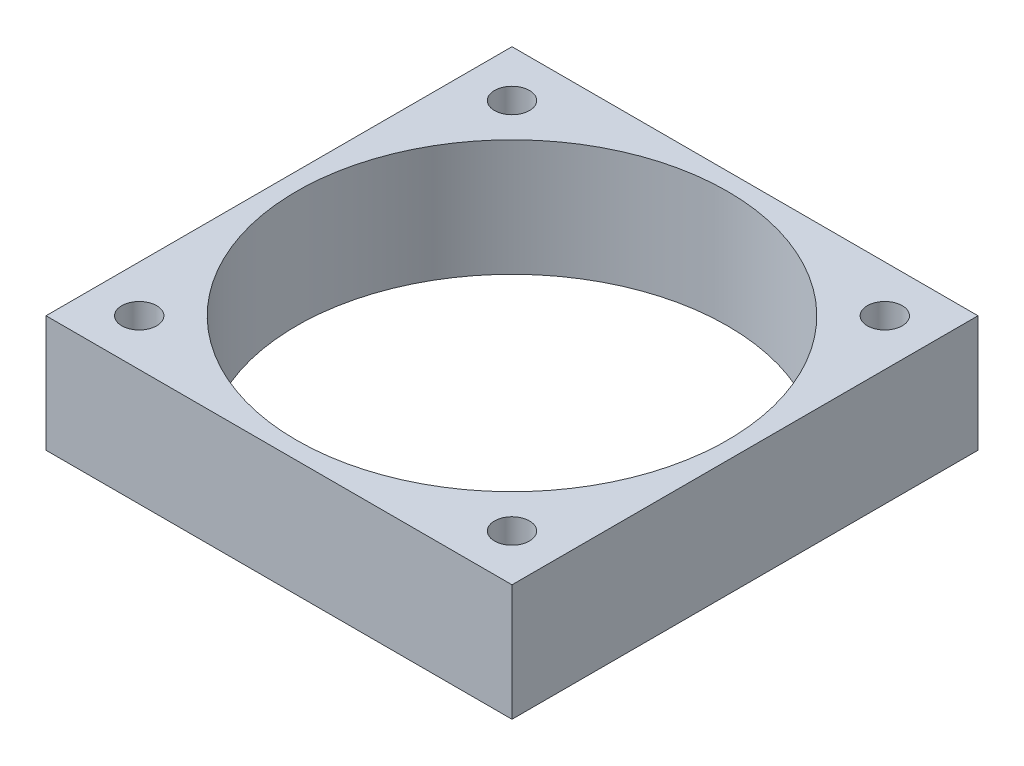
ISO-10303-21;
HEADER;
FILE_DESCRIPTION(('STEP AP214'),'2;1');
FILE_NAME('part.step','',(''),(''),'','','');
FILE_SCHEMA(('AUTOMOTIVE_DESIGN { 1 0 10303 214 1 1 1 1 }'));
ENDSEC;
DATA;
#1=APPLICATION_CONTEXT('core data for automotive mechanical design processes');
#2=APPLICATION_PROTOCOL_DEFINITION('international standard','automotive_design',2000,#1);
#3=PRODUCT_CONTEXT('',#1,'mechanical');
#4=PRODUCT('Part','Part','',(#3));
#5=PRODUCT_RELATED_PRODUCT_CATEGORY('part','',(#4));
#6=PRODUCT_DEFINITION_FORMATION('','',#4);
#7=PRODUCT_DEFINITION_CONTEXT('part definition',#1,'design');
#8=PRODUCT_DEFINITION('design','',#6,#7);
#9=PRODUCT_DEFINITION_SHAPE('','',#8);
#10=(LENGTH_UNIT() NAMED_UNIT(*) SI_UNIT(.MILLI.,.METRE.));
#11=(NAMED_UNIT(*) PLANE_ANGLE_UNIT() SI_UNIT($,.RADIAN.));
#12=(NAMED_UNIT(*) SI_UNIT($,.STERADIAN.) SOLID_ANGLE_UNIT());
#13=UNCERTAINTY_MEASURE_WITH_UNIT(LENGTH_MEASURE(1.E-05),#10,'distance_accuracy_value','');
#14=(GEOMETRIC_REPRESENTATION_CONTEXT(3) GLOBAL_UNCERTAINTY_ASSIGNED_CONTEXT((#13)) GLOBAL_UNIT_ASSIGNED_CONTEXT((#10,
#11,#12)) REPRESENTATION_CONTEXT('',''));
#15=CARTESIAN_POINT('',(0.,0.,0.));
#16=DIRECTION('',(0.,0.,1.));
#17=DIRECTION('',(1.,0.,0.));
#18=AXIS2_PLACEMENT_3D('',#15,#16,#17);
#19=CARTESIAN_POINT('',(0.,10.,0.));
#20=DIRECTION('',(1.,0.,0.));
#21=DIRECTION('',(0.,0.,-1.));
#22=AXIS2_PLACEMENT_3D('',#19,#20,#21);
#23=PLANE('',#22);
#24=DIRECTION('',(0.,0.,1.));
#25=VECTOR('',#24,1.);
#26=CARTESIAN_POINT('',(0.,0.,0.));
#27=LINE('',#26,#25);
#28=CARTESIAN_POINT('',(0.,0.,0.));
#29=VERTEX_POINT('',#28);
#30=CARTESIAN_POINT('',(0.,0.,40.));
#31=VERTEX_POINT('',#30);
#32=EDGE_CURVE('E95',#29,#31,#27,.T.);
#33=ORIENTED_EDGE('',*,*,#32,.T.);
#34=DIRECTION('',(0.,-1.,0.));
#35=VECTOR('',#34,1.);
#36=CARTESIAN_POINT('',(0.,10.,40.));
#37=LINE('',#36,#35);
#38=CARTESIAN_POINT('',(0.,10.,40.));
#39=VERTEX_POINT('',#38);
#40=EDGE_CURVE('E11',#39,#31,#37,.T.);
#41=ORIENTED_EDGE('',*,*,#40,.F.);
#42=DIRECTION('',(0.,0.,1.));
#43=VECTOR('',#42,1.);
#44=CARTESIAN_POINT('',(0.,10.,0.));
#45=LINE('',#44,#43);
#46=CARTESIAN_POINT('',(0.,10.,0.));
#47=VERTEX_POINT('',#46);
#48=EDGE_CURVE('E83',#47,#39,#45,.T.);
#49=ORIENTED_EDGE('',*,*,#48,.F.);
#50=DIRECTION('',(0.,-1.,0.));
#51=VECTOR('',#50,1.);
#52=CARTESIAN_POINT('',(0.,10.,0.));
#53=LINE('',#52,#51);
#54=EDGE_CURVE('E91',#47,#29,#53,.T.);
#55=ORIENTED_EDGE('',*,*,#54,.T.);
#56=EDGE_LOOP('',(#33,#41,#49,#55));
#57=FACE_BOUND('',#56,.T.);
#58=ADVANCED_FACE('F32',(#57),#23,.F.);
#59=CARTESIAN_POINT('',(0.,10.,40.));
#60=DIRECTION('',(0.,0.,-1.));
#61=DIRECTION('',(-1.,0.,0.));
#62=AXIS2_PLACEMENT_3D('',#59,#60,#61);
#63=PLANE('',#62);
#64=DIRECTION('',(1.,0.,0.));
#65=VECTOR('',#64,1.);
#66=CARTESIAN_POINT('',(0.,0.,40.));
#67=LINE('',#66,#65);
#68=CARTESIAN_POINT('',(40.,0.,40.));
#69=VERTEX_POINT('',#68);
#70=EDGE_CURVE('E87',#31,#69,#67,.T.);
#71=ORIENTED_EDGE('',*,*,#70,.T.);
#72=DIRECTION('',(0.,-1.,0.));
#73=VECTOR('',#72,1.);
#74=CARTESIAN_POINT('',(40.,10.,40.));
#75=LINE('',#74,#73);
#76=CARTESIAN_POINT('',(40.,10.,40.));
#77=VERTEX_POINT('',#76);
#78=EDGE_CURVE('E40',#77,#69,#75,.T.);
#79=ORIENTED_EDGE('',*,*,#78,.F.);
#80=DIRECTION('',(1.,0.,0.));
#81=VECTOR('',#80,1.);
#82=CARTESIAN_POINT('',(0.,10.,40.));
#83=LINE('',#82,#81);
#84=EDGE_CURVE('E78',#39,#77,#83,.T.);
#85=ORIENTED_EDGE('',*,*,#84,.F.);
#86=ORIENTED_EDGE('',*,*,#40,.T.);
#87=EDGE_LOOP('',(#71,#79,#85,#86));
#88=FACE_BOUND('',#87,.T.);
#89=ADVANCED_FACE('F86',(#88),#63,.F.);
#90=CARTESIAN_POINT('',(40.,10.,0.));
#91=DIRECTION('',(-1.,0.,0.));
#92=DIRECTION('',(0.,0.,1.));
#93=AXIS2_PLACEMENT_3D('',#90,#91,#92);
#94=PLANE('',#93);
#95=DIRECTION('',(0.,0.,-1.));
#96=VECTOR('',#95,1.);
#97=CARTESIAN_POINT('',(40.,0.,0.));
#98=LINE('',#97,#96);
#99=CARTESIAN_POINT('',(40.,0.,0.));
#100=VERTEX_POINT('',#99);
#101=EDGE_CURVE('E65',#69,#100,#98,.T.);
#102=ORIENTED_EDGE('',*,*,#101,.T.);
#103=DIRECTION('',(0.,-1.,0.));
#104=VECTOR('',#103,1.);
#105=CARTESIAN_POINT('',(40.,10.,0.));
#106=LINE('',#105,#104);
#107=CARTESIAN_POINT('',(40.,10.,0.));
#108=VERTEX_POINT('',#107);
#109=EDGE_CURVE('E88',#108,#100,#106,.T.);
#110=ORIENTED_EDGE('',*,*,#109,.F.);
#111=DIRECTION('',(0.,0.,-1.));
#112=VECTOR('',#111,1.);
#113=CARTESIAN_POINT('',(40.,10.,0.));
#114=LINE('',#113,#112);
#115=EDGE_CURVE('E81',#77,#108,#114,.T.);
#116=ORIENTED_EDGE('',*,*,#115,.F.);
#117=ORIENTED_EDGE('',*,*,#78,.T.);
#118=EDGE_LOOP('',(#102,#110,#116,#117));
#119=FACE_BOUND('',#118,.T.);
#120=ADVANCED_FACE('F89',(#119),#94,.F.);
#121=CARTESIAN_POINT('',(0.,10.,0.));
#122=DIRECTION('',(0.,0.,1.));
#123=DIRECTION('',(1.,0.,0.));
#124=AXIS2_PLACEMENT_3D('',#121,#122,#123);
#125=PLANE('',#124);
#126=DIRECTION('',(-1.,0.,0.));
#127=VECTOR('',#126,1.);
#128=CARTESIAN_POINT('',(0.,0.,0.));
#129=LINE('',#128,#127);
#130=EDGE_CURVE('E71',#100,#29,#129,.T.);
#131=ORIENTED_EDGE('',*,*,#130,.T.);
#132=ORIENTED_EDGE('',*,*,#54,.F.);
#133=DIRECTION('',(-1.,0.,0.));
#134=VECTOR('',#133,1.);
#135=CARTESIAN_POINT('',(0.,10.,0.));
#136=LINE('',#135,#134);
#137=EDGE_CURVE('E48',#108,#47,#136,.T.);
#138=ORIENTED_EDGE('',*,*,#137,.F.);
#139=ORIENTED_EDGE('',*,*,#109,.T.);
#140=EDGE_LOOP('',(#131,#132,#138,#139));
#141=FACE_BOUND('',#140,.T.);
#142=ADVANCED_FACE('F103',(#141),#125,.F.);
#143=CARTESIAN_POINT('',(0.,10.,0.));
#144=DIRECTION('',(0.,1.,0.));
#145=DIRECTION('',(0.,0.,1.));
#146=AXIS2_PLACEMENT_3D('',#143,#144,#145);
#147=PLANE('',#146);
#148=CARTESIAN_POINT('',(20.,10.,20.));
#149=DIRECTION('',(0.,1.,0.));
#150=DIRECTION('',(0.,0.,1.));
#151=AXIS2_PLACEMENT_3D('',#148,#149,#150);
#152=CIRCLE('',#151,18.5);
#153=CARTESIAN_POINT('',(20.,10.,38.5));
#154=VERTEX_POINT('',#153);
#155=EDGE_CURVE('E133',#154,#154,#152,.T.);
#156=ORIENTED_EDGE('',*,*,#155,.F.);
#157=EDGE_LOOP('',(#156));
#158=FACE_BOUND('',#157,.T.);
#159=CARTESIAN_POINT('',(36.,10.,35.9999999999996));
#160=DIRECTION('',(0.,1.,0.));
#161=DIRECTION('',(0.,0.,1.));
#162=AXIS2_PLACEMENT_3D('',#159,#160,#161);
#163=CIRCLE('',#162,1.5);
#164=CARTESIAN_POINT('',(36.,10.,37.4999999999996));
#165=VERTEX_POINT('',#164);
#166=EDGE_CURVE('E128',#165,#165,#163,.T.);
#167=ORIENTED_EDGE('',*,*,#166,.F.);
#168=EDGE_LOOP('',(#167));
#169=FACE_BOUND('',#168,.T.);
#170=CARTESIAN_POINT('',(35.9999999999999,10.,3.99999999999956));
#171=DIRECTION('',(0.,1.,0.));
#172=DIRECTION('',(0.,0.,1.));
#173=AXIS2_PLACEMENT_3D('',#170,#171,#172);
#174=CIRCLE('',#173,1.5);
#175=CARTESIAN_POINT('',(35.9999999999999,10.,5.49999999999956));
#176=VERTEX_POINT('',#175);
#177=EDGE_CURVE('E122',#176,#176,#174,.T.);
#178=ORIENTED_EDGE('',*,*,#177,.F.);
#179=EDGE_LOOP('',(#178));
#180=FACE_BOUND('',#179,.T.);
#181=CARTESIAN_POINT('',(3.99999999999989,10.,4.));
#182=DIRECTION('',(0.,1.,0.));
#183=DIRECTION('',(0.,0.,1.));
#184=AXIS2_PLACEMENT_3D('',#181,#182,#183);
#185=CIRCLE('',#184,1.5);
#186=CARTESIAN_POINT('',(3.99999999999989,10.,5.5));
#187=VERTEX_POINT('',#186);
#188=EDGE_CURVE('E115',#187,#187,#185,.T.);
#189=ORIENTED_EDGE('',*,*,#188,.F.);
#190=EDGE_LOOP('',(#189));
#191=FACE_BOUND('',#190,.T.);
#192=CARTESIAN_POINT('',(4.,10.,36.));
#193=DIRECTION('',(0.,1.,0.));
#194=DIRECTION('',(0.,0.,1.));
#195=AXIS2_PLACEMENT_3D('',#192,#193,#194);
#196=CIRCLE('',#195,1.5);
#197=CARTESIAN_POINT('',(4.,10.,37.5));
#198=VERTEX_POINT('',#197);
#199=EDGE_CURVE('E109',#198,#198,#196,.T.);
#200=ORIENTED_EDGE('',*,*,#199,.F.);
#201=EDGE_LOOP('',(#200));
#202=FACE_BOUND('',#201,.T.);
#203=ORIENTED_EDGE('',*,*,#48,.T.);
#204=ORIENTED_EDGE('',*,*,#84,.T.);
#205=ORIENTED_EDGE('',*,*,#115,.T.);
#206=ORIENTED_EDGE('',*,*,#137,.T.);
#207=EDGE_LOOP('',(#203,#204,#205,#206));
#208=FACE_BOUND('',#207,.T.);
#209=ADVANCED_FACE('F79',(#158,#169,#180,#191,#202,#208),#147,.T.);
#210=CARTESIAN_POINT('',(0.,0.,0.));
#211=DIRECTION('',(0.,1.,0.));
#212=DIRECTION('',(0.,0.,1.));
#213=AXIS2_PLACEMENT_3D('',#210,#211,#212);
#214=PLANE('',#213);
#215=CARTESIAN_POINT('',(20.,0.,20.));
#216=DIRECTION('',(0.,1.,0.));
#217=DIRECTION('',(0.,0.,1.));
#218=AXIS2_PLACEMENT_3D('',#215,#216,#217);
#219=CIRCLE('',#218,18.5);
#220=CARTESIAN_POINT('',(20.,0.,38.5));
#221=VERTEX_POINT('',#220);
#222=EDGE_CURVE('E119',#221,#221,#219,.T.);
#223=ORIENTED_EDGE('',*,*,#222,.T.);
#224=EDGE_LOOP('',(#223));
#225=FACE_BOUND('',#224,.T.);
#226=CARTESIAN_POINT('',(36.,0.,35.9999999999996));
#227=DIRECTION('',(0.,1.,0.));
#228=DIRECTION('',(0.,0.,1.));
#229=AXIS2_PLACEMENT_3D('',#226,#227,#228);
#230=CIRCLE('',#229,1.5);
#231=CARTESIAN_POINT('',(36.,0.,37.4999999999996));
#232=VERTEX_POINT('',#231);
#233=EDGE_CURVE('E112',#232,#232,#230,.T.);
#234=ORIENTED_EDGE('',*,*,#233,.T.);
#235=EDGE_LOOP('',(#234));
#236=FACE_BOUND('',#235,.T.);
#237=CARTESIAN_POINT('',(35.9999999999999,0.,3.99999999999956));
#238=DIRECTION('',(0.,1.,0.));
#239=DIRECTION('',(0.,0.,1.));
#240=AXIS2_PLACEMENT_3D('',#237,#238,#239);
#241=CIRCLE('',#240,1.5);
#242=CARTESIAN_POINT('',(35.9999999999999,0.,5.49999999999956));
#243=VERTEX_POINT('',#242);
#244=EDGE_CURVE('E125',#243,#243,#241,.T.);
#245=ORIENTED_EDGE('',*,*,#244,.T.);
#246=EDGE_LOOP('',(#245));
#247=FACE_BOUND('',#246,.T.);
#248=CARTESIAN_POINT('',(3.99999999999989,0.,4.));
#249=DIRECTION('',(0.,1.,0.));
#250=DIRECTION('',(0.,0.,1.));
#251=AXIS2_PLACEMENT_3D('',#248,#249,#250);
#252=CIRCLE('',#251,1.5);
#253=CARTESIAN_POINT('',(3.99999999999989,0.,5.5));
#254=VERTEX_POINT('',#253);
#255=EDGE_CURVE('E118',#254,#254,#252,.T.);
#256=ORIENTED_EDGE('',*,*,#255,.T.);
#257=EDGE_LOOP('',(#256));
#258=FACE_BOUND('',#257,.T.);
#259=CARTESIAN_POINT('',(4.,0.,36.));
#260=DIRECTION('',(0.,1.,0.));
#261=DIRECTION('',(0.,0.,1.));
#262=AXIS2_PLACEMENT_3D('',#259,#260,#261);
#263=CIRCLE('',#262,1.5);
#264=CARTESIAN_POINT('',(4.,0.,37.5));
#265=VERTEX_POINT('',#264);
#266=EDGE_CURVE('E98',#265,#265,#263,.T.);
#267=ORIENTED_EDGE('',*,*,#266,.T.);
#268=EDGE_LOOP('',(#267));
#269=FACE_BOUND('',#268,.T.);
#270=ORIENTED_EDGE('',*,*,#32,.F.);
#271=ORIENTED_EDGE('',*,*,#130,.F.);
#272=ORIENTED_EDGE('',*,*,#101,.F.);
#273=ORIENTED_EDGE('',*,*,#70,.F.);
#274=EDGE_LOOP('',(#270,#271,#272,#273));
#275=FACE_BOUND('',#274,.T.);
#276=ADVANCED_FACE('F106',(#225,#236,#247,#258,#269,#275),#214,.F.);
#277=CARTESIAN_POINT('',(4.,0.,36.));
#278=DIRECTION('',(0.,1.,0.));
#279=DIRECTION('',(0.,0.,1.));
#280=AXIS2_PLACEMENT_3D('',#277,#278,#279);
#281=CYLINDRICAL_SURFACE('',#280,1.5);
#282=ORIENTED_EDGE('',*,*,#266,.F.);
#283=EDGE_LOOP('',(#282));
#284=FACE_BOUND('',#283,.T.);
#285=ORIENTED_EDGE('',*,*,#199,.T.);
#286=EDGE_LOOP('',(#285));
#287=FACE_BOUND('',#286,.T.);
#288=ADVANCED_FACE('F159',(#284,#287),#281,.F.);
#289=CARTESIAN_POINT('',(3.99999999999989,0.,4.));
#290=DIRECTION('',(0.,1.,0.));
#291=DIRECTION('',(0.,0.,1.));
#292=AXIS2_PLACEMENT_3D('',#289,#290,#291);
#293=CYLINDRICAL_SURFACE('',#292,1.5);
#294=ORIENTED_EDGE('',*,*,#255,.F.);
#295=EDGE_LOOP('',(#294));
#296=FACE_BOUND('',#295,.T.);
#297=ORIENTED_EDGE('',*,*,#188,.T.);
#298=EDGE_LOOP('',(#297));
#299=FACE_BOUND('',#298,.T.);
#300=ADVANCED_FACE('F161',(#296,#299),#293,.F.);
#301=CARTESIAN_POINT('',(35.9999999999999,0.,3.99999999999956));
#302=DIRECTION('',(0.,1.,0.));
#303=DIRECTION('',(0.,0.,1.));
#304=AXIS2_PLACEMENT_3D('',#301,#302,#303);
#305=CYLINDRICAL_SURFACE('',#304,1.5);
#306=ORIENTED_EDGE('',*,*,#244,.F.);
#307=EDGE_LOOP('',(#306));
#308=FACE_BOUND('',#307,.T.);
#309=ORIENTED_EDGE('',*,*,#177,.T.);
#310=EDGE_LOOP('',(#309));
#311=FACE_BOUND('',#310,.T.);
#312=ADVANCED_FACE('F168',(#308,#311),#305,.F.);
#313=CARTESIAN_POINT('',(36.,0.,35.9999999999996));
#314=DIRECTION('',(0.,1.,0.));
#315=DIRECTION('',(0.,0.,1.));
#316=AXIS2_PLACEMENT_3D('',#313,#314,#315);
#317=CYLINDRICAL_SURFACE('',#316,1.5);
#318=ORIENTED_EDGE('',*,*,#233,.F.);
#319=EDGE_LOOP('',(#318));
#320=FACE_BOUND('',#319,.T.);
#321=ORIENTED_EDGE('',*,*,#166,.T.);
#322=EDGE_LOOP('',(#321));
#323=FACE_BOUND('',#322,.T.);
#324=ADVANCED_FACE('F144',(#320,#323),#317,.F.);
#325=CARTESIAN_POINT('',(20.,0.,20.));
#326=DIRECTION('',(0.,1.,0.));
#327=DIRECTION('',(0.,0.,1.));
#328=AXIS2_PLACEMENT_3D('',#325,#326,#327);
#329=CYLINDRICAL_SURFACE('',#328,18.5);
#330=ORIENTED_EDGE('',*,*,#222,.F.);
#331=EDGE_LOOP('',(#330));
#332=FACE_BOUND('',#331,.T.);
#333=ORIENTED_EDGE('',*,*,#155,.T.);
#334=EDGE_LOOP('',(#333));
#335=FACE_BOUND('',#334,.T.);
#336=ADVANCED_FACE('F141',(#332,#335),#329,.F.);
#337=CLOSED_SHELL('',(#58,#89,#120,#142,#209,#276,#288,#300,#312,#324,#336));
#338=MANIFOLD_SOLID_BREP('B2',#337);
#339=ADVANCED_BREP_SHAPE_REPRESENTATION('',(#18,#338),#14);
#340=SHAPE_DEFINITION_REPRESENTATION(#9,#339);
ENDSEC;
END-ISO-10303-21;
